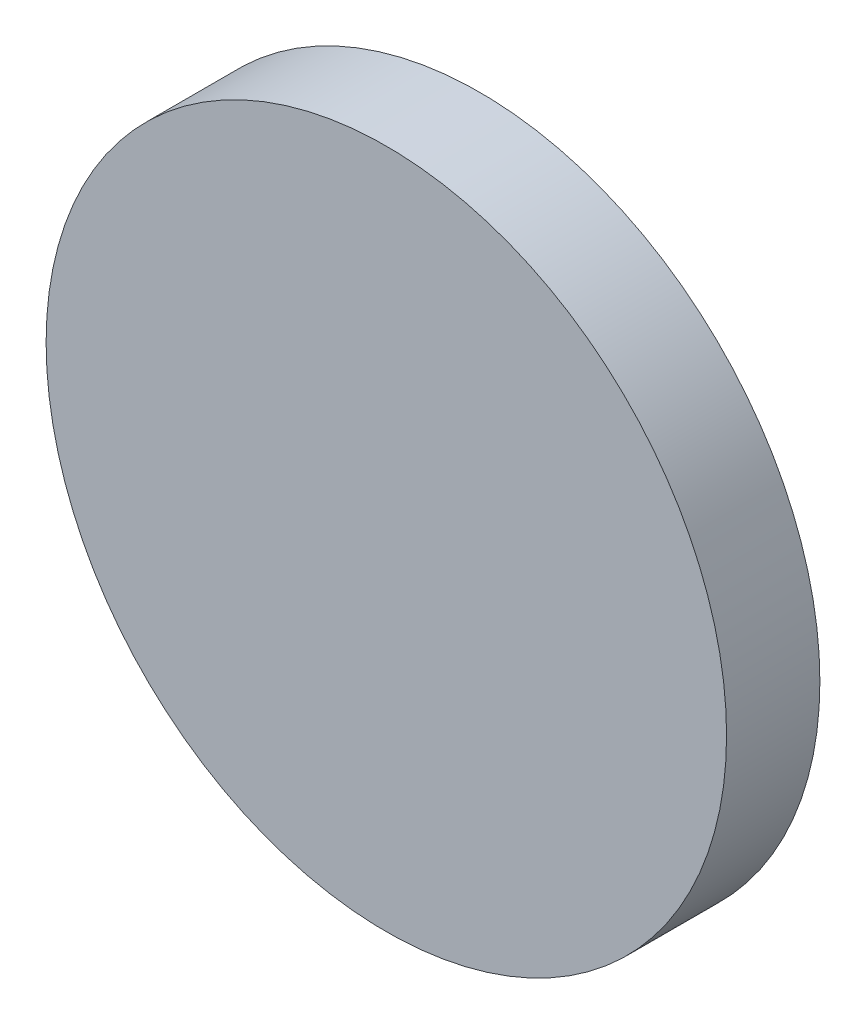
ISO-10303-21;
HEADER;
FILE_DESCRIPTION(('STEP AP214'),'2;1');
FILE_NAME('part.step','',(''),(''),'','','');
FILE_SCHEMA(('AUTOMOTIVE_DESIGN { 1 0 10303 214 1 1 1 1 }'));
ENDSEC;
DATA;
#1=APPLICATION_CONTEXT('core data for automotive mechanical design processes');
#2=APPLICATION_PROTOCOL_DEFINITION('international standard','automotive_design',2000,#1);
#3=PRODUCT_CONTEXT('',#1,'mechanical');
#4=PRODUCT('Part','Part','',(#3));
#5=PRODUCT_RELATED_PRODUCT_CATEGORY('part','',(#4));
#6=PRODUCT_DEFINITION_FORMATION('','',#4);
#7=PRODUCT_DEFINITION_CONTEXT('part definition',#1,'design');
#8=PRODUCT_DEFINITION('design','',#6,#7);
#9=PRODUCT_DEFINITION_SHAPE('','',#8);
#10=(LENGTH_UNIT() NAMED_UNIT(*) SI_UNIT(.MILLI.,.METRE.));
#11=(NAMED_UNIT(*) PLANE_ANGLE_UNIT() SI_UNIT($,.RADIAN.));
#12=(NAMED_UNIT(*) SI_UNIT($,.STERADIAN.) SOLID_ANGLE_UNIT());
#13=UNCERTAINTY_MEASURE_WITH_UNIT(LENGTH_MEASURE(1.E-05),#10,'distance_accuracy_value','');
#14=(GEOMETRIC_REPRESENTATION_CONTEXT(3) GLOBAL_UNCERTAINTY_ASSIGNED_CONTEXT((#13)) GLOBAL_UNIT_ASSIGNED_CONTEXT((#10,
#11,#12)) REPRESENTATION_CONTEXT('',''));
#15=CARTESIAN_POINT('',(0.,0.,0.));
#16=DIRECTION('',(0.,0.,1.));
#17=DIRECTION('',(1.,0.,0.));
#18=AXIS2_PLACEMENT_3D('',#15,#16,#17);
#19=CARTESIAN_POINT('',(-69.0181210276819,21.204975484693,20.));
#20=DIRECTION('',(0.,0.,-1.));
#21=DIRECTION('',(-1.,0.,0.));
#22=AXIS2_PLACEMENT_3D('',#19,#20,#21);
#23=CYLINDRICAL_SURFACE('',#22,72.9226293722548);
#24=CARTESIAN_POINT('',(-69.0181210276819,21.204975484693,20.));
#25=DIRECTION('',(0.,0.,1.));
#26=DIRECTION('',(1.,0.,0.));
#27=AXIS2_PLACEMENT_3D('',#24,#25,#26);
#28=CIRCLE('',#27,72.9226293722548);
#29=CARTESIAN_POINT('',(3.90450834457294,21.204975484693,20.));
#30=VERTEX_POINT('',#29);
#31=EDGE_CURVE('E10',#30,#30,#28,.T.);
#32=ORIENTED_EDGE('',*,*,#31,.F.);
#33=EDGE_LOOP('',(#32));
#34=FACE_BOUND('',#33,.T.);
#35=CARTESIAN_POINT('',(-69.0181210276819,21.204975484693,0.));
#36=DIRECTION('',(0.,0.,1.));
#37=DIRECTION('',(1.,0.,0.));
#38=AXIS2_PLACEMENT_3D('',#35,#36,#37);
#39=CIRCLE('',#38,72.9226293722548);
#40=CARTESIAN_POINT('',(3.90450834457294,21.204975484693,0.));
#41=VERTEX_POINT('',#40);
#42=EDGE_CURVE('E36',#41,#41,#39,.T.);
#43=ORIENTED_EDGE('',*,*,#42,.T.);
#44=EDGE_LOOP('',(#43));
#45=FACE_BOUND('',#44,.T.);
#46=ADVANCED_FACE('F33',(#34,#45),#23,.T.);
#47=CARTESIAN_POINT('',(-69.0181210276819,21.204975484693,20.));
#48=DIRECTION('',(0.,0.,1.));
#49=DIRECTION('',(1.,0.,0.));
#50=AXIS2_PLACEMENT_3D('',#47,#48,#49);
#51=PLANE('',#50);
#52=ORIENTED_EDGE('',*,*,#31,.T.);
#53=EDGE_LOOP('',(#52));
#54=FACE_BOUND('',#53,.T.);
#55=ADVANCED_FACE('F48',(#54),#51,.T.);
#56=CARTESIAN_POINT('',(-69.0181210276819,21.204975484693,0.));
#57=DIRECTION('',(0.,0.,1.));
#58=DIRECTION('',(1.,0.,0.));
#59=AXIS2_PLACEMENT_3D('',#56,#57,#58);
#60=PLANE('',#59);
#61=ORIENTED_EDGE('',*,*,#42,.F.);
#62=EDGE_LOOP('',(#61));
#63=FACE_BOUND('',#62,.T.);
#64=ADVANCED_FACE('F46',(#63),#60,.F.);
#65=CLOSED_SHELL('',(#46,#55,#64));
#66=MANIFOLD_SOLID_BREP('B2',#65);
#67=ADVANCED_BREP_SHAPE_REPRESENTATION('',(#18,#66),#14);
#68=SHAPE_DEFINITION_REPRESENTATION(#9,#67);
ENDSEC;
END-ISO-10303-21;
